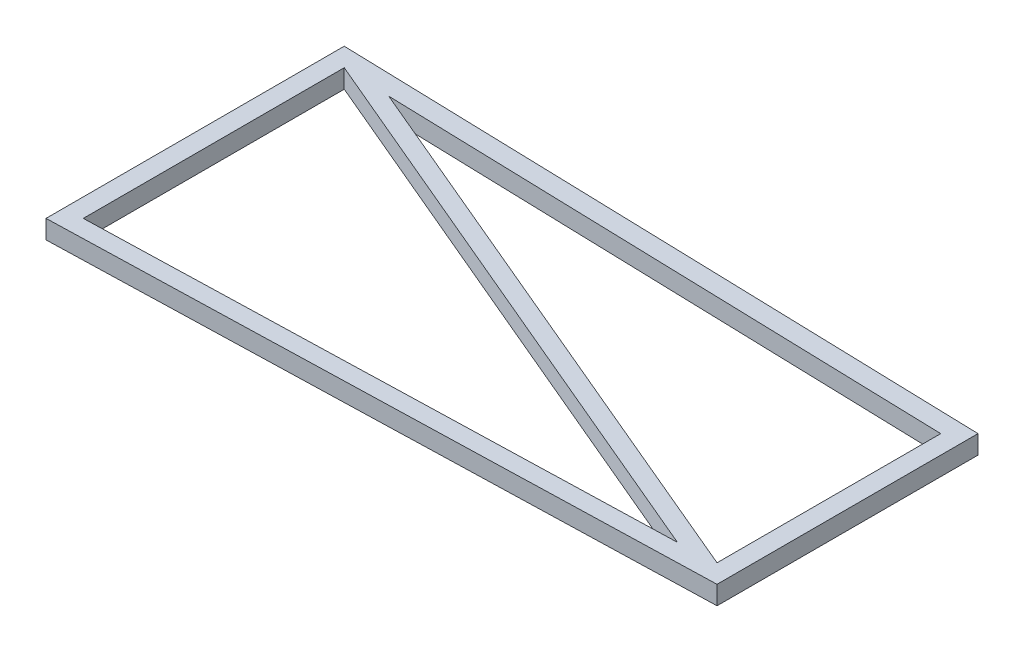
ISO-10303-21;
HEADER;
FILE_DESCRIPTION(('STEP AP214'),'2;1');
FILE_NAME('part.step','',(''),(''),'','','');
FILE_SCHEMA(('AUTOMOTIVE_DESIGN { 1 0 10303 214 1 1 1 1 }'));
ENDSEC;
DATA;
#1=APPLICATION_CONTEXT('core data for automotive mechanical design processes');
#2=APPLICATION_PROTOCOL_DEFINITION('international standard','automotive_design',2000,#1);
#3=PRODUCT_CONTEXT('',#1,'mechanical');
#4=PRODUCT('Part','Part','',(#3));
#5=PRODUCT_RELATED_PRODUCT_CATEGORY('part','',(#4));
#6=PRODUCT_DEFINITION_FORMATION('','',#4);
#7=PRODUCT_DEFINITION_CONTEXT('part definition',#1,'design');
#8=PRODUCT_DEFINITION('design','',#6,#7);
#9=PRODUCT_DEFINITION_SHAPE('','',#8);
#10=(LENGTH_UNIT() NAMED_UNIT(*) SI_UNIT(.MILLI.,.METRE.));
#11=(NAMED_UNIT(*) PLANE_ANGLE_UNIT() SI_UNIT($,.RADIAN.));
#12=(NAMED_UNIT(*) SI_UNIT($,.STERADIAN.) SOLID_ANGLE_UNIT());
#13=UNCERTAINTY_MEASURE_WITH_UNIT(LENGTH_MEASURE(1.E-05),#10,'distance_accuracy_value','');
#14=(GEOMETRIC_REPRESENTATION_CONTEXT(3) GLOBAL_UNCERTAINTY_ASSIGNED_CONTEXT((#13)) GLOBAL_UNIT_ASSIGNED_CONTEXT((#10,
#11,#12)) REPRESENTATION_CONTEXT('',''));
#15=CARTESIAN_POINT('',(0.,0.,0.));
#16=DIRECTION('',(0.,0.,1.));
#17=DIRECTION('',(1.,0.,0.));
#18=AXIS2_PLACEMENT_3D('',#15,#16,#17);
#19=CARTESIAN_POINT('',(0.,6.35,0.));
#20=DIRECTION('',(0.,-1.,0.));
#21=DIRECTION('',(0.,0.,-1.));
#22=AXIS2_PLACEMENT_3D('',#19,#20,#21);
#23=PLANE('',#22);
#24=DIRECTION('',(0.,0.,1.));
#25=VECTOR('',#24,1.);
#26=CARTESIAN_POINT('',(153.639073843107,6.35,59.1378207570711));
#27=LINE('',#26,#25);
#28=CARTESIAN_POINT('',(153.639073843107,6.35,-29.7621792429289));
#29=VERTEX_POINT('',#28);
#30=CARTESIAN_POINT('',(153.639073843107,6.35,59.1378207570711));
#31=VERTEX_POINT('',#30);
#32=EDGE_CURVE('E107',#29,#31,#27,.T.);
#33=ORIENTED_EDGE('',*,*,#32,.F.);
#34=DIRECTION('',(0.999592086460695,0.,0.028559773898877));
#35=VECTOR('',#34,1.);
#36=CARTESIAN_POINT('',(-68.6109261568934,6.35,-36.1121792429289));
#37=LINE('',#36,#35);
#38=CARTESIAN_POINT('',(-68.6109261568934,6.35,-36.1121792429289));
#39=VERTEX_POINT('',#38);
#40=EDGE_CURVE('E92',#39,#29,#37,.T.);
#41=ORIENTED_EDGE('',*,*,#40,.F.);
#42=DIRECTION('',(0.,0.,-1.));
#43=VECTOR('',#42,1.);
#44=CARTESIAN_POINT('',(-68.6109261568934,6.35,65.4878207570711));
#45=LINE('',#44,#43);
#46=CARTESIAN_POINT('',(-68.6109261568934,6.35,65.4878207570711));
#47=VERTEX_POINT('',#46);
#48=EDGE_CURVE('E102',#47,#39,#45,.T.);
#49=ORIENTED_EDGE('',*,*,#48,.F.);
#50=DIRECTION('',(-0.999592086460695,0.,0.028559773898877));
#51=VECTOR('',#50,1.);
#52=CARTESIAN_POINT('',(-68.6109261568934,6.35,65.4878207570711));
#53=LINE('',#52,#51);
#54=EDGE_CURVE('E114',#31,#47,#53,.T.);
#55=ORIENTED_EDGE('',*,*,#54,.F.);
#56=EDGE_LOOP('',(#33,#41,#49,#55));
#57=FACE_BOUND('',#56,.T.);
#58=DIRECTION('',(-0.999590378461893,0.,-0.0286194913722945));
#59=VECTOR('',#58,1.);
#60=CARTESIAN_POINT('',(0.790411037467562,6.35,-27.606614590206));
#61=LINE('',#60,#59);
#62=CARTESIAN_POINT('',(147.289073843107,6.35,-23.4121792429289));
#63=VERTEX_POINT('',#62);
#64=CARTESIAN_POINT('',(-46.3065927055006,6.35,-28.955059234458));
#65=VERTEX_POINT('',#64);
#66=EDGE_CURVE('E164',#63,#65,#61,.T.);
#67=ORIENTED_EDGE('',*,*,#66,.F.);
#68=DIRECTION('',(0.,0.,-1.));
#69=VECTOR('',#68,1.);
#70=CARTESIAN_POINT('',(147.289073843107,6.35,52.7878207570711));
#71=LINE('',#70,#69);
#72=CARTESIAN_POINT('',(147.289073843107,6.35,52.7878207570711));
#73=VERTEX_POINT('',#72);
#74=EDGE_CURVE('E116',#73,#63,#71,.T.);
#75=ORIENTED_EDGE('',*,*,#74,.F.);
#76=DIRECTION('',(0.921245319758808,0.,0.388982082906772));
#77=VECTOR('',#76,1.);
#78=CARTESIAN_POINT('',(3.36947090810987,6.35,-7.98008299241804));
#79=LINE('',#78,#77);
#80=EDGE_CURVE('E161',#65,#73,#79,.T.);
#81=ORIENTED_EDGE('',*,*,#80,.F.);
#82=EDGE_LOOP('',(#67,#75,#81));
#83=FACE_BOUND('',#82,.T.);
#84=DIRECTION('',(0.999590378461893,0.,-0.0286194913722949));
#85=VECTOR('',#84,1.);
#86=CARTESIAN_POINT('',(1.64080468287001,6.35,57.3082362854224));
#87=LINE('',#86,#85);
#88=CARTESIAN_POINT('',(-62.2609261568934,6.35,59.1378207570711));
#89=VERTEX_POINT('',#88);
#90=CARTESIAN_POINT('',(134.50843984333,6.35,53.5040738804349));
#91=VERTEX_POINT('',#90);
#92=EDGE_CURVE('E141',#89,#91,#87,.T.);
#93=ORIENTED_EDGE('',*,*,#92,.F.);
#94=DIRECTION('',(0.,0.,1.));
#95=VECTOR('',#94,1.);
#96=CARTESIAN_POINT('',(-62.2609261568934,6.35,0.));
#97=LINE('',#96,#95);
#98=CARTESIAN_POINT('',(-62.2609261568934,6.35,-29.7621792429289));
#99=VERTEX_POINT('',#98);
#100=EDGE_CURVE('E137',#99,#89,#97,.T.);
#101=ORIENTED_EDGE('',*,*,#100,.F.);
#102=DIRECTION('',(-0.920937562869329,0.,-0.389710155495465));
#103=VECTOR('',#102,1.);
#104=CARTESIAN_POINT('',(1.22579183041904,6.35,-2.89671111971928));
#105=LINE('',#104,#103);
#106=EDGE_CURVE('E139',#91,#99,#105,.T.);
#107=ORIENTED_EDGE('',*,*,#106,.F.);
#108=EDGE_LOOP('',(#93,#101,#107));
#109=FACE_BOUND('',#108,.T.);
#110=ADVANCED_FACE('F16',(#57,#83,#109),#23,.F.);
#111=CARTESIAN_POINT('',(0.,0.,0.));
#112=DIRECTION('',(0.,-1.,0.));
#113=DIRECTION('',(0.,0.,-1.));
#114=AXIS2_PLACEMENT_3D('',#111,#112,#113);
#115=PLANE('',#114);
#116=DIRECTION('',(0.,0.,-1.));
#117=VECTOR('',#116,1.);
#118=CARTESIAN_POINT('',(147.289073843107,0.,52.7878207570711));
#119=LINE('',#118,#117);
#120=CARTESIAN_POINT('',(147.289073843107,0.,52.7878207570711));
#121=VERTEX_POINT('',#120);
#122=CARTESIAN_POINT('',(147.289073843107,0.,-23.4121792429289));
#123=VERTEX_POINT('',#122);
#124=EDGE_CURVE('E148',#121,#123,#119,.T.);
#125=ORIENTED_EDGE('',*,*,#124,.T.);
#126=DIRECTION('',(-0.999590378461893,0.,-0.0286194913722945));
#127=VECTOR('',#126,1.);
#128=CARTESIAN_POINT('',(147.289073843107,0.,-23.4121792429289));
#129=LINE('',#128,#127);
#130=CARTESIAN_POINT('',(-46.3065927055006,0.,-28.955059234458));
#131=VERTEX_POINT('',#130);
#132=EDGE_CURVE('E143',#123,#131,#129,.T.);
#133=ORIENTED_EDGE('',*,*,#132,.T.);
#134=DIRECTION('',(0.921245319758808,0.,0.388982082906772));
#135=VECTOR('',#134,1.);
#136=CARTESIAN_POINT('',(-46.3065927055006,0.,-28.955059234458));
#137=LINE('',#136,#135);
#138=EDGE_CURVE('E144',#131,#121,#137,.T.);
#139=ORIENTED_EDGE('',*,*,#138,.T.);
#140=EDGE_LOOP('',(#125,#133,#139));
#141=FACE_BOUND('',#140,.T.);
#142=DIRECTION('',(-0.999592086460695,0.,0.028559773898877));
#143=VECTOR('',#142,1.);
#144=CARTESIAN_POINT('',(-68.6109261568934,0.,65.4878207570711));
#145=LINE('',#144,#143);
#146=CARTESIAN_POINT('',(153.639073843107,0.,59.1378207570711));
#147=VERTEX_POINT('',#146);
#148=CARTESIAN_POINT('',(-68.6109261568934,0.,65.4878207570711));
#149=VERTEX_POINT('',#148);
#150=EDGE_CURVE('E166',#147,#149,#145,.T.);
#151=ORIENTED_EDGE('',*,*,#150,.T.);
#152=DIRECTION('',(0.,0.,-1.));
#153=VECTOR('',#152,1.);
#154=CARTESIAN_POINT('',(-68.6109261568934,0.,65.4878207570711));
#155=LINE('',#154,#153);
#156=CARTESIAN_POINT('',(-68.6109261568934,0.,-36.1121792429289));
#157=VERTEX_POINT('',#156);
#158=EDGE_CURVE('E169',#149,#157,#155,.T.);
#159=ORIENTED_EDGE('',*,*,#158,.T.);
#160=DIRECTION('',(0.999592086460695,0.,0.028559773898877));
#161=VECTOR('',#160,1.);
#162=CARTESIAN_POINT('',(-68.6109261568934,0.,-36.1121792429289));
#163=LINE('',#162,#161);
#164=CARTESIAN_POINT('',(153.639073843107,0.,-29.7621792429289));
#165=VERTEX_POINT('',#164);
#166=EDGE_CURVE('E173',#157,#165,#163,.T.);
#167=ORIENTED_EDGE('',*,*,#166,.T.);
#168=DIRECTION('',(0.,0.,1.));
#169=VECTOR('',#168,1.);
#170=CARTESIAN_POINT('',(153.639073843107,0.,59.1378207570711));
#171=LINE('',#170,#169);
#172=EDGE_CURVE('E109',#165,#147,#171,.T.);
#173=ORIENTED_EDGE('',*,*,#172,.T.);
#174=EDGE_LOOP('',(#151,#159,#167,#173));
#175=FACE_BOUND('',#174,.T.);
#176=DIRECTION('',(0.,0.,1.));
#177=VECTOR('',#176,1.);
#178=CARTESIAN_POINT('',(-62.2609261568934,0.,59.1378207570711));
#179=LINE('',#178,#177);
#180=CARTESIAN_POINT('',(-62.2609261568934,0.,-29.7621792429289));
#181=VERTEX_POINT('',#180);
#182=CARTESIAN_POINT('',(-62.2609261568934,0.,59.1378207570711));
#183=VERTEX_POINT('',#182);
#184=EDGE_CURVE('E126',#181,#183,#179,.T.);
#185=ORIENTED_EDGE('',*,*,#184,.T.);
#186=DIRECTION('',(0.999590378461893,0.,-0.0286194913722949));
#187=VECTOR('',#186,1.);
#188=CARTESIAN_POINT('',(-62.2609261568934,0.,59.1378207570711));
#189=LINE('',#188,#187);
#190=CARTESIAN_POINT('',(134.50843984333,0.,53.5040738804349));
#191=VERTEX_POINT('',#190);
#192=EDGE_CURVE('E39',#183,#191,#189,.T.);
#193=ORIENTED_EDGE('',*,*,#192,.T.);
#194=DIRECTION('',(-0.92093756286933,0.,-0.389710155495465));
#195=VECTOR('',#194,1.);
#196=CARTESIAN_POINT('',(134.50843984333,0.,53.5040738804349));
#197=LINE('',#196,#195);
#198=EDGE_CURVE('E122',#191,#181,#197,.T.);
#199=ORIENTED_EDGE('',*,*,#198,.T.);
#200=EDGE_LOOP('',(#185,#193,#199));
#201=FACE_BOUND('',#200,.T.);
#202=ADVANCED_FACE('F185',(#141,#175,#201),#115,.T.);
#203=CARTESIAN_POINT('',(-68.6109261568934,6.35,65.4878207570711));
#204=DIRECTION('',(0.028559773898877,0.,0.999592086460695));
#205=DIRECTION('',(0.999592086460695,0.,-0.028559773898877));
#206=AXIS2_PLACEMENT_3D('',#203,#204,#205);
#207=PLANE('',#206);
#208=ORIENTED_EDGE('',*,*,#150,.F.);
#209=DIRECTION('',(0.,-1.,0.));
#210=VECTOR('',#209,1.);
#211=CARTESIAN_POINT('',(153.639073843107,6.35,59.1378207570711));
#212=LINE('',#211,#210);
#213=EDGE_CURVE('E111',#31,#147,#212,.T.);
#214=ORIENTED_EDGE('',*,*,#213,.F.);
#215=ORIENTED_EDGE('',*,*,#54,.T.);
#216=DIRECTION('',(0.,-1.,0.));
#217=VECTOR('',#216,1.);
#218=CARTESIAN_POINT('',(-68.6109261568934,6.35,65.4878207570711));
#219=LINE('',#218,#217);
#220=EDGE_CURVE('E10',#47,#149,#219,.T.);
#221=ORIENTED_EDGE('',*,*,#220,.T.);
#222=EDGE_LOOP('',(#208,#214,#215,#221));
#223=FACE_BOUND('',#222,.T.);
#224=ADVANCED_FACE('F18',(#223),#207,.T.);
#225=CARTESIAN_POINT('',(-68.6109261568934,6.35,65.4878207570711));
#226=DIRECTION('',(-1.,0.,0.));
#227=DIRECTION('',(0.,0.,1.));
#228=AXIS2_PLACEMENT_3D('',#225,#226,#227);
#229=PLANE('',#228);
#230=ORIENTED_EDGE('',*,*,#158,.F.);
#231=ORIENTED_EDGE('',*,*,#220,.F.);
#232=ORIENTED_EDGE('',*,*,#48,.T.);
#233=DIRECTION('',(0.,-1.,0.));
#234=VECTOR('',#233,1.);
#235=CARTESIAN_POINT('',(-68.6109261568934,6.35,-36.1121792429289));
#236=LINE('',#235,#234);
#237=EDGE_CURVE('E24',#39,#157,#236,.T.);
#238=ORIENTED_EDGE('',*,*,#237,.T.);
#239=EDGE_LOOP('',(#230,#231,#232,#238));
#240=FACE_BOUND('',#239,.T.);
#241=ADVANCED_FACE('F182',(#240),#229,.T.);
#242=CARTESIAN_POINT('',(-68.6109261568934,6.35,-36.1121792429289));
#243=DIRECTION('',(0.028559773898877,0.,-0.999592086460695));
#244=DIRECTION('',(-0.999592086460695,0.,-0.028559773898877));
#245=AXIS2_PLACEMENT_3D('',#242,#243,#244);
#246=PLANE('',#245);
#247=ORIENTED_EDGE('',*,*,#40,.T.);
#248=DIRECTION('',(0.,-1.,0.));
#249=VECTOR('',#248,1.);
#250=CARTESIAN_POINT('',(153.639073843107,6.35,-29.7621792429289));
#251=LINE('',#250,#249);
#252=EDGE_CURVE('E96',#29,#165,#251,.T.);
#253=ORIENTED_EDGE('',*,*,#252,.T.);
#254=ORIENTED_EDGE('',*,*,#166,.F.);
#255=ORIENTED_EDGE('',*,*,#237,.F.);
#256=EDGE_LOOP('',(#247,#253,#254,#255));
#257=FACE_BOUND('',#256,.T.);
#258=ADVANCED_FACE('F94',(#257),#246,.T.);
#259=CARTESIAN_POINT('',(147.289073843107,41.179162517892,-23.4121792429289));
#260=DIRECTION('',(-0.0286194913722945,0.,0.999590378461893));
#261=DIRECTION('',(0.999590378461893,0.,0.0286194913722945));
#262=AXIS2_PLACEMENT_3D('',#259,#260,#261);
#263=PLANE('',#262);
#264=DIRECTION('',(0.,-1.,0.));
#265=VECTOR('',#264,1.);
#266=CARTESIAN_POINT('',(147.289073843107,41.179162517892,-23.4121792429289));
#267=LINE('',#266,#265);
#268=EDGE_CURVE('E152',#63,#123,#267,.T.);
#269=ORIENTED_EDGE('',*,*,#268,.F.);
#270=ORIENTED_EDGE('',*,*,#66,.T.);
#271=DIRECTION('',(0.,-1.,0.));
#272=VECTOR('',#271,1.);
#273=CARTESIAN_POINT('',(-46.3065927055006,41.179162517892,-28.955059234458));
#274=LINE('',#273,#272);
#275=EDGE_CURVE('E159',#65,#131,#274,.T.);
#276=ORIENTED_EDGE('',*,*,#275,.T.);
#277=ORIENTED_EDGE('',*,*,#132,.F.);
#278=EDGE_LOOP('',(#269,#270,#276,#277));
#279=FACE_BOUND('',#278,.T.);
#280=ADVANCED_FACE('F202',(#279),#263,.T.);
#281=CARTESIAN_POINT('',(-46.3065927055006,41.179162517892,-28.955059234458));
#282=DIRECTION('',(0.388982082906772,0.,-0.921245319758808));
#283=DIRECTION('',(-0.921245319758808,0.,-0.388982082906772));
#284=AXIS2_PLACEMENT_3D('',#281,#282,#283);
#285=PLANE('',#284);
#286=ORIENTED_EDGE('',*,*,#80,.T.);
#287=DIRECTION('',(0.,-1.,0.));
#288=VECTOR('',#287,1.);
#289=CARTESIAN_POINT('',(147.289073843107,41.179162517892,52.7878207570711));
#290=LINE('',#289,#288);
#291=EDGE_CURVE('E157',#73,#121,#290,.T.);
#292=ORIENTED_EDGE('',*,*,#291,.T.);
#293=ORIENTED_EDGE('',*,*,#138,.F.);
#294=ORIENTED_EDGE('',*,*,#275,.F.);
#295=EDGE_LOOP('',(#286,#292,#293,#294));
#296=FACE_BOUND('',#295,.T.);
#297=ADVANCED_FACE('F209',(#296),#285,.T.);
#298=CARTESIAN_POINT('',(147.289073843107,41.179162517892,52.7878207570711));
#299=DIRECTION('',(-1.,0.,0.));
#300=DIRECTION('',(0.,0.,1.));
#301=AXIS2_PLACEMENT_3D('',#298,#299,#300);
#302=PLANE('',#301);
#303=ORIENTED_EDGE('',*,*,#291,.F.);
#304=ORIENTED_EDGE('',*,*,#74,.T.);
#305=ORIENTED_EDGE('',*,*,#268,.T.);
#306=ORIENTED_EDGE('',*,*,#124,.F.);
#307=EDGE_LOOP('',(#303,#304,#305,#306));
#308=FACE_BOUND('',#307,.T.);
#309=ADVANCED_FACE('F214',(#308),#302,.T.);
#310=CARTESIAN_POINT('',(-62.2609261568934,41.179162517892,59.1378207570711));
#311=DIRECTION('',(-0.0286194913722949,0.,-0.999590378461893));
#312=DIRECTION('',(-0.999590378461893,0.,0.0286194913722949));
#313=AXIS2_PLACEMENT_3D('',#310,#311,#312);
#314=PLANE('',#313);
#315=ORIENTED_EDGE('',*,*,#92,.T.);
#316=DIRECTION('',(0.,-1.,0.));
#317=VECTOR('',#316,1.);
#318=CARTESIAN_POINT('',(134.50843984333,41.179162517892,53.5040738804349));
#319=LINE('',#318,#317);
#320=EDGE_CURVE('E135',#91,#191,#319,.T.);
#321=ORIENTED_EDGE('',*,*,#320,.T.);
#322=ORIENTED_EDGE('',*,*,#192,.F.);
#323=DIRECTION('',(0.,-1.,0.));
#324=VECTOR('',#323,1.);
#325=CARTESIAN_POINT('',(-62.2609261568934,41.179162517892,59.1378207570711));
#326=LINE('',#325,#324);
#327=EDGE_CURVE('E130',#89,#183,#326,.T.);
#328=ORIENTED_EDGE('',*,*,#327,.F.);
#329=EDGE_LOOP('',(#315,#321,#322,#328));
#330=FACE_BOUND('',#329,.T.);
#331=ADVANCED_FACE('F226',(#330),#314,.T.);
#332=CARTESIAN_POINT('',(134.50843984333,41.179162517892,53.5040738804349));
#333=DIRECTION('',(-0.389710155495465,0.,0.920937562869329));
#334=DIRECTION('',(0.920937562869329,0.,0.389710155495465));
#335=AXIS2_PLACEMENT_3D('',#332,#333,#334);
#336=PLANE('',#335);
#337=ORIENTED_EDGE('',*,*,#106,.T.);
#338=DIRECTION('',(0.,-1.,0.));
#339=VECTOR('',#338,1.);
#340=CARTESIAN_POINT('',(-62.2609261568934,41.179162517892,-29.7621792429289));
#341=LINE('',#340,#339);
#342=EDGE_CURVE('E31',#99,#181,#341,.T.);
#343=ORIENTED_EDGE('',*,*,#342,.T.);
#344=ORIENTED_EDGE('',*,*,#198,.F.);
#345=ORIENTED_EDGE('',*,*,#320,.F.);
#346=EDGE_LOOP('',(#337,#343,#344,#345));
#347=FACE_BOUND('',#346,.T.);
#348=ADVANCED_FACE('F231',(#347),#336,.T.);
#349=CARTESIAN_POINT('',(-62.2609261568934,41.179162517892,59.1378207570711));
#350=DIRECTION('',(1.,0.,0.));
#351=DIRECTION('',(0.,0.,-1.));
#352=AXIS2_PLACEMENT_3D('',#349,#350,#351);
#353=PLANE('',#352);
#354=ORIENTED_EDGE('',*,*,#100,.T.);
#355=ORIENTED_EDGE('',*,*,#327,.T.);
#356=ORIENTED_EDGE('',*,*,#184,.F.);
#357=ORIENTED_EDGE('',*,*,#342,.F.);
#358=EDGE_LOOP('',(#354,#355,#356,#357));
#359=FACE_BOUND('',#358,.T.);
#360=ADVANCED_FACE('F236',(#359),#353,.T.);
#361=CARTESIAN_POINT('',(153.639073843107,6.35,59.1378207570711));
#362=DIRECTION('',(1.,0.,0.));
#363=DIRECTION('',(0.,0.,-1.));
#364=AXIS2_PLACEMENT_3D('',#361,#362,#363);
#365=PLANE('',#364);
#366=ORIENTED_EDGE('',*,*,#172,.F.);
#367=ORIENTED_EDGE('',*,*,#252,.F.);
#368=ORIENTED_EDGE('',*,*,#32,.T.);
#369=ORIENTED_EDGE('',*,*,#213,.T.);
#370=EDGE_LOOP('',(#366,#367,#368,#369));
#371=FACE_BOUND('',#370,.T.);
#372=ADVANCED_FACE('F106',(#371),#365,.T.);
#373=CLOSED_SHELL('',(#110,#202,#224,#241,#258,#280,#297,#309,#331,#348,#360,#372));
#374=MANIFOLD_SOLID_BREP('B1',#373);
#375=ADVANCED_BREP_SHAPE_REPRESENTATION('',(#18,#374),#14);
#376=SHAPE_DEFINITION_REPRESENTATION(#9,#375);
ENDSEC;
END-ISO-10303-21;
